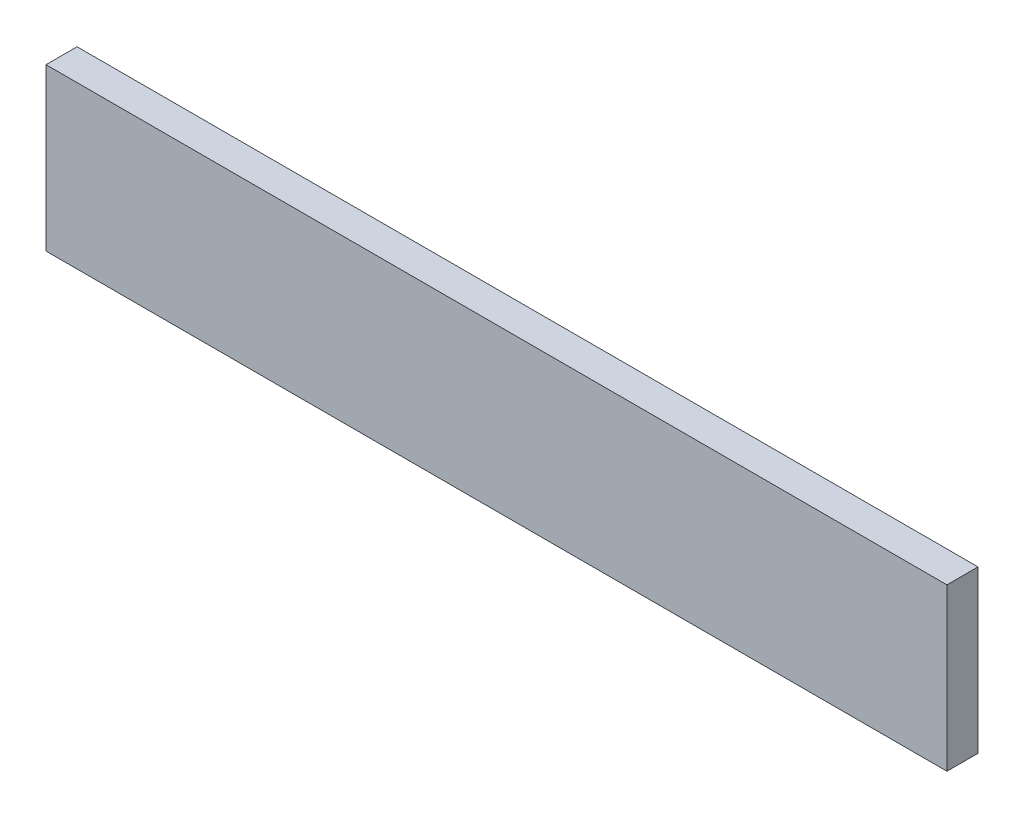
ISO-10303-21;
HEADER;
FILE_DESCRIPTION(('STEP AP214'),'2;1');
FILE_NAME('part.step','',(''),(''),'','','');
FILE_SCHEMA(('AUTOMOTIVE_DESIGN { 1 0 10303 214 1 1 1 1 }'));
ENDSEC;
DATA;
#1=APPLICATION_CONTEXT('core data for automotive mechanical design processes');
#2=APPLICATION_PROTOCOL_DEFINITION('international standard','automotive_design',2000,#1);
#3=PRODUCT_CONTEXT('',#1,'mechanical');
#4=PRODUCT('Part','Part','',(#3));
#5=PRODUCT_RELATED_PRODUCT_CATEGORY('part','',(#4));
#6=PRODUCT_DEFINITION_FORMATION('','',#4);
#7=PRODUCT_DEFINITION_CONTEXT('part definition',#1,'design');
#8=PRODUCT_DEFINITION('design','',#6,#7);
#9=PRODUCT_DEFINITION_SHAPE('','',#8);
#10=(LENGTH_UNIT() NAMED_UNIT(*) SI_UNIT(.MILLI.,.METRE.));
#11=(NAMED_UNIT(*) PLANE_ANGLE_UNIT() SI_UNIT($,.RADIAN.));
#12=(NAMED_UNIT(*) SI_UNIT($,.STERADIAN.) SOLID_ANGLE_UNIT());
#13=UNCERTAINTY_MEASURE_WITH_UNIT(LENGTH_MEASURE(1.E-05),#10,'distance_accuracy_value','');
#14=(GEOMETRIC_REPRESENTATION_CONTEXT(3) GLOBAL_UNCERTAINTY_ASSIGNED_CONTEXT((#13)) GLOBAL_UNIT_ASSIGNED_CONTEXT((#10,
#11,#12)) REPRESENTATION_CONTEXT('',''));
#15=CARTESIAN_POINT('',(0.,0.,0.));
#16=DIRECTION('',(0.,0.,1.));
#17=DIRECTION('',(1.,0.,0.));
#18=AXIS2_PLACEMENT_3D('',#15,#16,#17);
#19=CARTESIAN_POINT('',(276.225,-49.50079,19.05));
#20=DIRECTION('',(-1.,0.,0.));
#21=DIRECTION('',(0.,0.,1.));
#22=AXIS2_PLACEMENT_3D('',#19,#20,#21);
#23=PLANE('',#22);
#24=DIRECTION('',(0.,1.,0.));
#25=VECTOR('',#24,1.);
#26=CARTESIAN_POINT('',(276.225,-49.50079,0.));
#27=LINE('',#26,#25);
#28=CARTESIAN_POINT('',(276.225,-49.50079,0.));
#29=VERTEX_POINT('',#28);
#30=CARTESIAN_POINT('',(276.225,49.50079,0.));
#31=VERTEX_POINT('',#30);
#32=EDGE_CURVE('E96',#29,#31,#27,.T.);
#33=ORIENTED_EDGE('',*,*,#32,.T.);
#34=DIRECTION('',(0.,0.,-1.));
#35=VECTOR('',#34,1.);
#36=CARTESIAN_POINT('',(276.225,49.50079,19.05));
#37=LINE('',#36,#35);
#38=CARTESIAN_POINT('',(276.225,49.50079,19.05));
#39=VERTEX_POINT('',#38);
#40=EDGE_CURVE('E11',#39,#31,#37,.T.);
#41=ORIENTED_EDGE('',*,*,#40,.F.);
#42=DIRECTION('',(0.,1.,0.));
#43=VECTOR('',#42,1.);
#44=CARTESIAN_POINT('',(276.225,-49.50079,19.05));
#45=LINE('',#44,#43);
#46=CARTESIAN_POINT('',(276.225,-49.50079,19.05));
#47=VERTEX_POINT('',#46);
#48=EDGE_CURVE('E84',#47,#39,#45,.T.);
#49=ORIENTED_EDGE('',*,*,#48,.F.);
#50=DIRECTION('',(0.,0.,-1.));
#51=VECTOR('',#50,1.);
#52=CARTESIAN_POINT('',(276.225,-49.50079,19.05));
#53=LINE('',#52,#51);
#54=EDGE_CURVE('E92',#47,#29,#53,.T.);
#55=ORIENTED_EDGE('',*,*,#54,.T.);
#56=EDGE_LOOP('',(#33,#41,#49,#55));
#57=FACE_BOUND('',#56,.T.);
#58=ADVANCED_FACE('F33',(#57),#23,.F.);
#59=CARTESIAN_POINT('',(-276.225,49.50079,19.05));
#60=DIRECTION('',(0.,-1.,0.));
#61=DIRECTION('',(0.,0.,-1.));
#62=AXIS2_PLACEMENT_3D('',#59,#60,#61);
#63=PLANE('',#62);
#64=DIRECTION('',(-1.,0.,0.));
#65=VECTOR('',#64,1.);
#66=CARTESIAN_POINT('',(-276.225,49.50079,0.));
#67=LINE('',#66,#65);
#68=CARTESIAN_POINT('',(-276.225,49.50079,0.));
#69=VERTEX_POINT('',#68);
#70=EDGE_CURVE('E88',#31,#69,#67,.T.);
#71=ORIENTED_EDGE('',*,*,#70,.T.);
#72=DIRECTION('',(0.,0.,-1.));
#73=VECTOR('',#72,1.);
#74=CARTESIAN_POINT('',(-276.225,49.50079,19.05));
#75=LINE('',#74,#73);
#76=CARTESIAN_POINT('',(-276.225,49.50079,19.05));
#77=VERTEX_POINT('',#76);
#78=EDGE_CURVE('E41',#77,#69,#75,.T.);
#79=ORIENTED_EDGE('',*,*,#78,.F.);
#80=DIRECTION('',(-1.,0.,0.));
#81=VECTOR('',#80,1.);
#82=CARTESIAN_POINT('',(-276.225,49.50079,19.05));
#83=LINE('',#82,#81);
#84=EDGE_CURVE('E79',#39,#77,#83,.T.);
#85=ORIENTED_EDGE('',*,*,#84,.F.);
#86=ORIENTED_EDGE('',*,*,#40,.T.);
#87=EDGE_LOOP('',(#71,#79,#85,#86));
#88=FACE_BOUND('',#87,.T.);
#89=ADVANCED_FACE('F87',(#88),#63,.F.);
#90=CARTESIAN_POINT('',(-276.225,-49.50079,19.05));
#91=DIRECTION('',(1.,0.,0.));
#92=DIRECTION('',(0.,0.,-1.));
#93=AXIS2_PLACEMENT_3D('',#90,#91,#92);
#94=PLANE('',#93);
#95=DIRECTION('',(0.,-1.,0.));
#96=VECTOR('',#95,1.);
#97=CARTESIAN_POINT('',(-276.225,-49.50079,0.));
#98=LINE('',#97,#96);
#99=CARTESIAN_POINT('',(-276.225,-49.50079,0.));
#100=VERTEX_POINT('',#99);
#101=EDGE_CURVE('E66',#69,#100,#98,.T.);
#102=ORIENTED_EDGE('',*,*,#101,.T.);
#103=DIRECTION('',(0.,0.,-1.));
#104=VECTOR('',#103,1.);
#105=CARTESIAN_POINT('',(-276.225,-49.50079,19.05));
#106=LINE('',#105,#104);
#107=CARTESIAN_POINT('',(-276.225,-49.50079,19.05));
#108=VERTEX_POINT('',#107);
#109=EDGE_CURVE('E89',#108,#100,#106,.T.);
#110=ORIENTED_EDGE('',*,*,#109,.F.);
#111=DIRECTION('',(0.,-1.,0.));
#112=VECTOR('',#111,1.);
#113=CARTESIAN_POINT('',(-276.225,-49.50079,19.05));
#114=LINE('',#113,#112);
#115=EDGE_CURVE('E82',#77,#108,#114,.T.);
#116=ORIENTED_EDGE('',*,*,#115,.F.);
#117=ORIENTED_EDGE('',*,*,#78,.T.);
#118=EDGE_LOOP('',(#102,#110,#116,#117));
#119=FACE_BOUND('',#118,.T.);
#120=ADVANCED_FACE('F90',(#119),#94,.F.);
#121=CARTESIAN_POINT('',(-276.225,-49.50079,19.05));
#122=DIRECTION('',(0.,1.,0.));
#123=DIRECTION('',(0.,0.,1.));
#124=AXIS2_PLACEMENT_3D('',#121,#122,#123);
#125=PLANE('',#124);
#126=DIRECTION('',(1.,0.,0.));
#127=VECTOR('',#126,1.);
#128=CARTESIAN_POINT('',(-276.225,-49.50079,0.));
#129=LINE('',#128,#127);
#130=EDGE_CURVE('E72',#100,#29,#129,.T.);
#131=ORIENTED_EDGE('',*,*,#130,.T.);
#132=ORIENTED_EDGE('',*,*,#54,.F.);
#133=DIRECTION('',(1.,0.,0.));
#134=VECTOR('',#133,1.);
#135=CARTESIAN_POINT('',(-276.225,-49.50079,19.05));
#136=LINE('',#135,#134);
#137=EDGE_CURVE('E49',#108,#47,#136,.T.);
#138=ORIENTED_EDGE('',*,*,#137,.F.);
#139=ORIENTED_EDGE('',*,*,#109,.T.);
#140=EDGE_LOOP('',(#131,#132,#138,#139));
#141=FACE_BOUND('',#140,.T.);
#142=ADVANCED_FACE('F103',(#141),#125,.F.);
#143=CARTESIAN_POINT('',(0.,0.,19.05));
#144=DIRECTION('',(0.,0.,-1.));
#145=DIRECTION('',(-1.,0.,0.));
#146=AXIS2_PLACEMENT_3D('',#143,#144,#145);
#147=PLANE('',#146);
#148=ORIENTED_EDGE('',*,*,#48,.T.);
#149=ORIENTED_EDGE('',*,*,#84,.T.);
#150=ORIENTED_EDGE('',*,*,#115,.T.);
#151=ORIENTED_EDGE('',*,*,#137,.T.);
#152=EDGE_LOOP('',(#148,#149,#150,#151));
#153=FACE_BOUND('',#152,.T.);
#154=ADVANCED_FACE('F80',(#153),#147,.F.);
#155=CARTESIAN_POINT('',(0.,0.,0.));
#156=DIRECTION('',(0.,0.,-1.));
#157=DIRECTION('',(-1.,0.,0.));
#158=AXIS2_PLACEMENT_3D('',#155,#156,#157);
#159=PLANE('',#158);
#160=ORIENTED_EDGE('',*,*,#32,.F.);
#161=ORIENTED_EDGE('',*,*,#130,.F.);
#162=ORIENTED_EDGE('',*,*,#101,.F.);
#163=ORIENTED_EDGE('',*,*,#70,.F.);
#164=EDGE_LOOP('',(#160,#161,#162,#163));
#165=FACE_BOUND('',#164,.T.);
#166=ADVANCED_FACE('F106',(#165),#159,.T.);
#167=CLOSED_SHELL('',(#58,#89,#120,#142,#154,#166));
#168=MANIFOLD_SOLID_BREP('B2',#167);
#169=ADVANCED_BREP_SHAPE_REPRESENTATION('',(#18,#168),#14);
#170=SHAPE_DEFINITION_REPRESENTATION(#9,#169);
ENDSEC;
END-ISO-10303-21;
